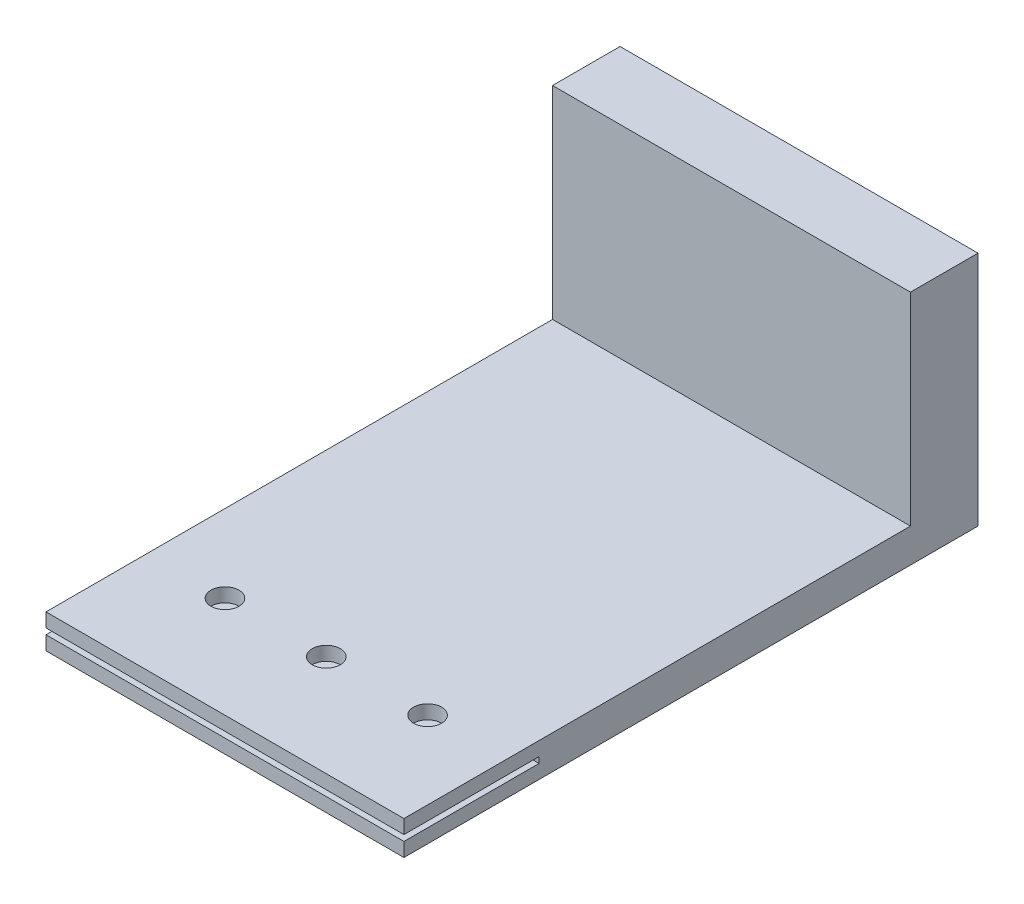
ISO-10303-21;
HEADER;
FILE_DESCRIPTION(('STEP AP214'),'2;1');
FILE_NAME('part.step','',(''),(''),'','','');
FILE_SCHEMA(('AUTOMOTIVE_DESIGN { 1 0 10303 214 1 1 1 1 }'));
ENDSEC;
DATA;
#1=APPLICATION_CONTEXT('core data for automotive mechanical design processes');
#2=APPLICATION_PROTOCOL_DEFINITION('international standard','automotive_design',2000,#1);
#3=PRODUCT_CONTEXT('',#1,'mechanical');
#4=PRODUCT('Part','Part','',(#3));
#5=PRODUCT_RELATED_PRODUCT_CATEGORY('part','',(#4));
#6=PRODUCT_DEFINITION_FORMATION('','',#4);
#7=PRODUCT_DEFINITION_CONTEXT('part definition',#1,'design');
#8=PRODUCT_DEFINITION('design','',#6,#7);
#9=PRODUCT_DEFINITION_SHAPE('','',#8);
#10=(LENGTH_UNIT() NAMED_UNIT(*) SI_UNIT(.MILLI.,.METRE.));
#11=(NAMED_UNIT(*) PLANE_ANGLE_UNIT() SI_UNIT($,.RADIAN.));
#12=(NAMED_UNIT(*) SI_UNIT($,.STERADIAN.) SOLID_ANGLE_UNIT());
#13=UNCERTAINTY_MEASURE_WITH_UNIT(LENGTH_MEASURE(1.E-05),#10,'distance_accuracy_value','');
#14=(GEOMETRIC_REPRESENTATION_CONTEXT(3) GLOBAL_UNCERTAINTY_ASSIGNED_CONTEXT((#13)) GLOBAL_UNIT_ASSIGNED_CONTEXT((#10,
#11,#12)) REPRESENTATION_CONTEXT('',''));
#15=CARTESIAN_POINT('',(0.,0.,0.));
#16=DIRECTION('',(0.,0.,1.));
#17=DIRECTION('',(1.,0.,0.));
#18=AXIS2_PLACEMENT_3D('',#15,#16,#17);
#19=CARTESIAN_POINT('',(53.,10.,85.));
#20=DIRECTION('',(-1.,0.,0.));
#21=DIRECTION('',(0.,0.,1.));
#22=AXIS2_PLACEMENT_3D('',#19,#20,#21);
#23=PLANE('',#22);
#24=DIRECTION('',(0.,0.,-1.));
#25=VECTOR('',#24,1.);
#26=CARTESIAN_POINT('',(53.,10.,85.));
#27=LINE('',#26,#25);
#28=CARTESIAN_POINT('',(53.,10.,85.));
#29=VERTEX_POINT('',#28);
#30=CARTESIAN_POINT('',(53.,10.,-65.));
#31=VERTEX_POINT('',#30);
#32=EDGE_CURVE('E113',#29,#31,#27,.T.);
#33=ORIENTED_EDGE('',*,*,#32,.F.);
#34=DIRECTION('',(0.,-1.,0.));
#35=VECTOR('',#34,1.);
#36=CARTESIAN_POINT('',(53.,10.,85.));
#37=LINE('',#36,#35);
#38=CARTESIAN_POINT('',(53.,5.87500000000001,85.));
#39=VERTEX_POINT('',#38);
#40=EDGE_CURVE('E117',#29,#39,#37,.T.);
#41=ORIENTED_EDGE('',*,*,#40,.T.);
#42=DIRECTION('',(0.,0.,1.));
#43=VECTOR('',#42,1.);
#44=CARTESIAN_POINT('',(53.,5.87500000000001,45.));
#45=LINE('',#44,#43);
#46=CARTESIAN_POINT('',(53.,5.87500000000001,45.));
#47=VERTEX_POINT('',#46);
#48=EDGE_CURVE('E186',#47,#39,#45,.T.);
#49=ORIENTED_EDGE('',*,*,#48,.F.);
#50=DIRECTION('',(0.,1.,0.));
#51=VECTOR('',#50,1.);
#52=CARTESIAN_POINT('',(53.,0.,45.));
#53=LINE('',#52,#51);
#54=CARTESIAN_POINT('',(53.,4.12500000000001,45.));
#55=VERTEX_POINT('',#54);
#56=EDGE_CURVE('E182',#55,#47,#53,.T.);
#57=ORIENTED_EDGE('',*,*,#56,.F.);
#58=DIRECTION('',(0.,0.,1.));
#59=VECTOR('',#58,1.);
#60=CARTESIAN_POINT('',(53.,4.12500000000001,45.));
#61=LINE('',#60,#59);
#62=CARTESIAN_POINT('',(53.,4.12500000000001,85.));
#63=VERTEX_POINT('',#62);
#64=EDGE_CURVE('E188',#55,#63,#61,.T.);
#65=ORIENTED_EDGE('',*,*,#64,.T.);
#66=CARTESIAN_POINT('',(53.,0.,85.));
#67=VERTEX_POINT('',#66);
#68=EDGE_CURVE('E133',#63,#67,#37,.T.);
#69=ORIENTED_EDGE('',*,*,#68,.T.);
#70=DIRECTION('',(0.,0.,-1.));
#71=VECTOR('',#70,1.);
#72=CARTESIAN_POINT('',(53.,0.,85.));
#73=LINE('',#72,#71);
#74=CARTESIAN_POINT('',(53.,0.,-85.));
#75=VERTEX_POINT('',#74);
#76=EDGE_CURVE('E211',#67,#75,#73,.T.);
#77=ORIENTED_EDGE('',*,*,#76,.T.);
#78=DIRECTION('',(0.,-1.,0.));
#79=VECTOR('',#78,1.);
#80=CARTESIAN_POINT('',(53.,10.,-85.));
#81=LINE('',#80,#79);
#82=CARTESIAN_POINT('',(53.,70.,-85.));
#83=VERTEX_POINT('',#82);
#84=EDGE_CURVE('E46',#83,#75,#81,.T.);
#85=ORIENTED_EDGE('',*,*,#84,.F.);
#86=DIRECTION('',(0.,0.,-1.));
#87=VECTOR('',#86,1.);
#88=CARTESIAN_POINT('',(53.,70.,-85.));
#89=LINE('',#88,#87);
#90=CARTESIAN_POINT('',(53.,70.,-65.));
#91=VERTEX_POINT('',#90);
#92=EDGE_CURVE('E203',#91,#83,#89,.T.);
#93=ORIENTED_EDGE('',*,*,#92,.F.);
#94=DIRECTION('',(0.,-1.,0.));
#95=VECTOR('',#94,1.);
#96=CARTESIAN_POINT('',(53.,70.,-65.));
#97=LINE('',#96,#95);
#98=EDGE_CURVE('E125',#91,#31,#97,.T.);
#99=ORIENTED_EDGE('',*,*,#98,.T.);
#100=EDGE_LOOP('',(#33,#41,#49,#57,#65,#69,#77,#85,#93,#99));
#101=FACE_BOUND('',#100,.T.);
#102=ADVANCED_FACE('F39',(#101),#23,.F.);
#103=CARTESIAN_POINT('',(-53.,10.,85.));
#104=DIRECTION('',(0.,0.,-1.));
#105=DIRECTION('',(-1.,0.,0.));
#106=AXIS2_PLACEMENT_3D('',#103,#104,#105);
#107=PLANE('',#106);
#108=DIRECTION('',(1.,0.,0.));
#109=VECTOR('',#108,1.);
#110=CARTESIAN_POINT('',(0.,4.12500000000001,85.));
#111=LINE('',#110,#109);
#112=CARTESIAN_POINT('',(-53.,4.12500000000001,85.));
#113=VERTEX_POINT('',#112);
#114=EDGE_CURVE('E177',#113,#63,#111,.T.);
#115=ORIENTED_EDGE('',*,*,#114,.F.);
#116=DIRECTION('',(0.,-1.,0.));
#117=VECTOR('',#116,1.);
#118=CARTESIAN_POINT('',(-53.,10.,85.));
#119=LINE('',#118,#117);
#120=CARTESIAN_POINT('',(-53.,0.,85.));
#121=VERTEX_POINT('',#120);
#122=EDGE_CURVE('E132',#113,#121,#119,.T.);
#123=ORIENTED_EDGE('',*,*,#122,.T.);
#124=DIRECTION('',(1.,0.,0.));
#125=VECTOR('',#124,1.);
#126=CARTESIAN_POINT('',(-53.,0.,85.));
#127=LINE('',#126,#125);
#128=EDGE_CURVE('E124',#121,#67,#127,.T.);
#129=ORIENTED_EDGE('',*,*,#128,.T.);
#130=ORIENTED_EDGE('',*,*,#68,.F.);
#131=EDGE_LOOP('',(#115,#123,#129,#130));
#132=FACE_BOUND('',#131,.T.);
#133=ADVANCED_FACE('F227',(#132),#107,.F.);
#134=CARTESIAN_POINT('',(0.,10.,0.));
#135=DIRECTION('',(0.,-1.,0.));
#136=DIRECTION('',(0.,0.,-1.));
#137=AXIS2_PLACEMENT_3D('',#134,#135,#136);
#138=PLANE('',#137);
#139=CARTESIAN_POINT('',(-30.,10.,55.));
#140=DIRECTION('',(0.,1.,0.));
#141=DIRECTION('',(0.,0.,1.));
#142=AXIS2_PLACEMENT_3D('',#139,#140,#141);
#143=CIRCLE('',#142,4.15);
#144=CARTESIAN_POINT('',(-30.,10.,59.15));
#145=VERTEX_POINT('',#144);
#146=EDGE_CURVE('E147',#145,#145,#143,.T.);
#147=ORIENTED_EDGE('',*,*,#146,.F.);
#148=EDGE_LOOP('',(#147));
#149=FACE_BOUND('',#148,.T.);
#150=CARTESIAN_POINT('',(0.,10.,55.));
#151=DIRECTION('',(0.,1.,0.));
#152=DIRECTION('',(0.,0.,1.));
#153=AXIS2_PLACEMENT_3D('',#150,#151,#152);
#154=CIRCLE('',#153,4.15);
#155=CARTESIAN_POINT('',(0.,10.,59.15));
#156=VERTEX_POINT('',#155);
#157=EDGE_CURVE('E313',#156,#156,#154,.T.);
#158=ORIENTED_EDGE('',*,*,#157,.F.);
#159=EDGE_LOOP('',(#158));
#160=FACE_BOUND('',#159,.T.);
#161=CARTESIAN_POINT('',(30.,10.,55.));
#162=DIRECTION('',(0.,1.,0.));
#163=DIRECTION('',(0.,0.,1.));
#164=AXIS2_PLACEMENT_3D('',#161,#162,#163);
#165=CIRCLE('',#164,4.15);
#166=CARTESIAN_POINT('',(30.,10.,59.15));
#167=VERTEX_POINT('',#166);
#168=EDGE_CURVE('E306',#167,#167,#165,.T.);
#169=ORIENTED_EDGE('',*,*,#168,.F.);
#170=EDGE_LOOP('',(#169));
#171=FACE_BOUND('',#170,.T.);
#172=DIRECTION('',(1.,0.,0.));
#173=VECTOR('',#172,1.);
#174=CARTESIAN_POINT('',(-53.,10.,-65.));
#175=LINE('',#174,#173);
#176=CARTESIAN_POINT('',(-53.,10.,-65.));
#177=VERTEX_POINT('',#176);
#178=EDGE_CURVE('E187',#177,#31,#175,.T.);
#179=ORIENTED_EDGE('',*,*,#178,.F.);
#180=DIRECTION('',(0.,0.,1.));
#181=VECTOR('',#180,1.);
#182=CARTESIAN_POINT('',(-53.,10.,85.));
#183=LINE('',#182,#181);
#184=CARTESIAN_POINT('',(-53.,10.,85.));
#185=VERTEX_POINT('',#184);
#186=EDGE_CURVE('E52',#177,#185,#183,.T.);
#187=ORIENTED_EDGE('',*,*,#186,.T.);
#188=DIRECTION('',(-1.,0.,0.));
#189=VECTOR('',#188,1.);
#190=CARTESIAN_POINT('',(-53.,10.,85.));
#191=LINE('',#190,#189);
#192=EDGE_CURVE('E11',#29,#185,#191,.T.);
#193=ORIENTED_EDGE('',*,*,#192,.F.);
#194=ORIENTED_EDGE('',*,*,#32,.T.);
#195=EDGE_LOOP('',(#179,#187,#193,#194));
#196=FACE_BOUND('',#195,.T.);
#197=ADVANCED_FACE('F127',(#149,#160,#171,#196),#138,.F.);
#198=CARTESIAN_POINT('',(-53.,10.,-85.));
#199=DIRECTION('',(0.,0.,1.));
#200=DIRECTION('',(1.,0.,0.));
#201=AXIS2_PLACEMENT_3D('',#198,#199,#200);
#202=PLANE('',#201);
#203=DIRECTION('',(-1.,0.,0.));
#204=VECTOR('',#203,1.);
#205=CARTESIAN_POINT('',(-53.,0.,-85.));
#206=LINE('',#205,#204);
#207=CARTESIAN_POINT('',(-53.,0.,-85.));
#208=VERTEX_POINT('',#207);
#209=EDGE_CURVE('E216',#75,#208,#206,.T.);
#210=ORIENTED_EDGE('',*,*,#209,.T.);
#211=DIRECTION('',(0.,-1.,0.));
#212=VECTOR('',#211,1.);
#213=CARTESIAN_POINT('',(-53.,10.,-85.));
#214=LINE('',#213,#212);
#215=CARTESIAN_POINT('',(-53.,70.,-85.));
#216=VERTEX_POINT('',#215);
#217=EDGE_CURVE('E143',#216,#208,#214,.T.);
#218=ORIENTED_EDGE('',*,*,#217,.F.);
#219=DIRECTION('',(-1.,0.,0.));
#220=VECTOR('',#219,1.);
#221=CARTESIAN_POINT('',(-53.,70.,-85.));
#222=LINE('',#221,#220);
#223=EDGE_CURVE('E204',#83,#216,#222,.T.);
#224=ORIENTED_EDGE('',*,*,#223,.F.);
#225=ORIENTED_EDGE('',*,*,#84,.T.);
#226=EDGE_LOOP('',(#210,#218,#224,#225));
#227=FACE_BOUND('',#226,.T.);
#228=ADVANCED_FACE('F239',(#227),#202,.F.);
#229=CARTESIAN_POINT('',(-53.,10.,85.));
#230=DIRECTION('',(1.,0.,0.));
#231=DIRECTION('',(0.,0.,-1.));
#232=AXIS2_PLACEMENT_3D('',#229,#230,#231);
#233=PLANE('',#232);
#234=CARTESIAN_POINT('',(-53.,5.87500000000001,85.));
#235=VERTEX_POINT('',#234);
#236=EDGE_CURVE('E137',#185,#235,#119,.T.);
#237=ORIENTED_EDGE('',*,*,#236,.F.);
#238=ORIENTED_EDGE('',*,*,#186,.F.);
#239=DIRECTION('',(0.,-1.,0.));
#240=VECTOR('',#239,1.);
#241=CARTESIAN_POINT('',(-53.,70.,-65.));
#242=LINE('',#241,#240);
#243=CARTESIAN_POINT('',(-53.,70.,-65.));
#244=VERTEX_POINT('',#243);
#245=EDGE_CURVE('E207',#244,#177,#242,.T.);
#246=ORIENTED_EDGE('',*,*,#245,.F.);
#247=DIRECTION('',(0.,0.,1.));
#248=VECTOR('',#247,1.);
#249=CARTESIAN_POINT('',(-53.,70.,-85.));
#250=LINE('',#249,#248);
#251=EDGE_CURVE('E198',#216,#244,#250,.T.);
#252=ORIENTED_EDGE('',*,*,#251,.F.);
#253=ORIENTED_EDGE('',*,*,#217,.T.);
#254=DIRECTION('',(0.,0.,1.));
#255=VECTOR('',#254,1.);
#256=CARTESIAN_POINT('',(-53.,0.,85.));
#257=LINE('',#256,#255);
#258=EDGE_CURVE('E220',#208,#121,#257,.T.);
#259=ORIENTED_EDGE('',*,*,#258,.T.);
#260=ORIENTED_EDGE('',*,*,#122,.F.);
#261=DIRECTION('',(0.,0.,1.));
#262=VECTOR('',#261,1.);
#263=CARTESIAN_POINT('',(-53.,4.12500000000001,45.));
#264=LINE('',#263,#262);
#265=CARTESIAN_POINT('',(-53.,4.12500000000001,45.));
#266=VERTEX_POINT('',#265);
#267=EDGE_CURVE('E195',#266,#113,#264,.T.);
#268=ORIENTED_EDGE('',*,*,#267,.F.);
#269=DIRECTION('',(0.,-1.,0.));
#270=VECTOR('',#269,1.);
#271=CARTESIAN_POINT('',(-53.,0.,45.));
#272=LINE('',#271,#270);
#273=CARTESIAN_POINT('',(-53.,5.87500000000001,45.));
#274=VERTEX_POINT('',#273);
#275=EDGE_CURVE('E174',#274,#266,#272,.T.);
#276=ORIENTED_EDGE('',*,*,#275,.F.);
#277=DIRECTION('',(0.,0.,1.));
#278=VECTOR('',#277,1.);
#279=CARTESIAN_POINT('',(-53.,5.87500000000001,45.));
#280=LINE('',#279,#278);
#281=EDGE_CURVE('E181',#274,#235,#280,.T.);
#282=ORIENTED_EDGE('',*,*,#281,.T.);
#283=EDGE_LOOP('',(#237,#238,#246,#252,#253,#259,#260,#268,#276,#282));
#284=FACE_BOUND('',#283,.T.);
#285=ADVANCED_FACE('F240',(#284),#233,.F.);
#286=ORIENTED_EDGE('',*,*,#40,.F.);
#287=ORIENTED_EDGE('',*,*,#192,.T.);
#288=ORIENTED_EDGE('',*,*,#236,.T.);
#289=DIRECTION('',(1.,0.,0.));
#290=VECTOR('',#289,1.);
#291=CARTESIAN_POINT('',(0.,5.87500000000001,85.));
#292=LINE('',#291,#290);
#293=EDGE_CURVE('E135',#235,#39,#292,.T.);
#294=ORIENTED_EDGE('',*,*,#293,.T.);
#295=EDGE_LOOP('',(#286,#287,#288,#294));
#296=FACE_BOUND('',#295,.T.);
#297=ADVANCED_FACE('F128',(#296),#107,.F.);
#298=CARTESIAN_POINT('',(0.,0.,0.));
#299=DIRECTION('',(0.,-1.,0.));
#300=DIRECTION('',(0.,0.,-1.));
#301=AXIS2_PLACEMENT_3D('',#298,#299,#300);
#302=PLANE('',#301);
#303=CARTESIAN_POINT('',(-30.,0.,55.));
#304=DIRECTION('',(0.,-1.,0.));
#305=DIRECTION('',(0.,0.,-1.));
#306=AXIS2_PLACEMENT_3D('',#303,#304,#305);
#307=CIRCLE('',#306,4.15);
#308=CARTESIAN_POINT('',(-30.,0.,50.85));
#309=VERTEX_POINT('',#308);
#310=EDGE_CURVE('E165',#309,#309,#307,.T.);
#311=ORIENTED_EDGE('',*,*,#310,.F.);
#312=EDGE_LOOP('',(#311));
#313=FACE_BOUND('',#312,.T.);
#314=CARTESIAN_POINT('',(0.,0.,55.));
#315=DIRECTION('',(0.,-1.,0.));
#316=DIRECTION('',(0.,0.,-1.));
#317=AXIS2_PLACEMENT_3D('',#314,#315,#316);
#318=CIRCLE('',#317,4.15);
#319=CARTESIAN_POINT('',(0.,0.,50.85));
#320=VERTEX_POINT('',#319);
#321=EDGE_CURVE('E158',#320,#320,#318,.T.);
#322=ORIENTED_EDGE('',*,*,#321,.F.);
#323=EDGE_LOOP('',(#322));
#324=FACE_BOUND('',#323,.T.);
#325=CARTESIAN_POINT('',(30.,0.,55.));
#326=DIRECTION('',(0.,-1.,0.));
#327=DIRECTION('',(0.,0.,-1.));
#328=AXIS2_PLACEMENT_3D('',#325,#326,#327);
#329=CIRCLE('',#328,4.15);
#330=CARTESIAN_POINT('',(30.,0.,50.85));
#331=VERTEX_POINT('',#330);
#332=EDGE_CURVE('E152',#331,#331,#329,.T.);
#333=ORIENTED_EDGE('',*,*,#332,.F.);
#334=EDGE_LOOP('',(#333));
#335=FACE_BOUND('',#334,.T.);
#336=ORIENTED_EDGE('',*,*,#76,.F.);
#337=ORIENTED_EDGE('',*,*,#128,.F.);
#338=ORIENTED_EDGE('',*,*,#258,.F.);
#339=ORIENTED_EDGE('',*,*,#209,.F.);
#340=EDGE_LOOP('',(#336,#337,#338,#339));
#341=FACE_BOUND('',#340,.T.);
#342=ADVANCED_FACE('F229',(#313,#324,#335,#341),#302,.T.);
#343=CARTESIAN_POINT('',(-53.,70.,-65.));
#344=DIRECTION('',(0.,0.,-1.));
#345=DIRECTION('',(-1.,0.,0.));
#346=AXIS2_PLACEMENT_3D('',#343,#344,#345);
#347=PLANE('',#346);
#348=ORIENTED_EDGE('',*,*,#178,.T.);
#349=ORIENTED_EDGE('',*,*,#98,.F.);
#350=DIRECTION('',(1.,0.,0.));
#351=VECTOR('',#350,1.);
#352=CARTESIAN_POINT('',(-53.,70.,-65.));
#353=LINE('',#352,#351);
#354=EDGE_CURVE('E200',#244,#91,#353,.T.);
#355=ORIENTED_EDGE('',*,*,#354,.F.);
#356=ORIENTED_EDGE('',*,*,#245,.T.);
#357=EDGE_LOOP('',(#348,#349,#355,#356));
#358=FACE_BOUND('',#357,.T.);
#359=ADVANCED_FACE('F261',(#358),#347,.F.);
#360=CARTESIAN_POINT('',(0.,70.,0.));
#361=DIRECTION('',(0.,1.,0.));
#362=DIRECTION('',(0.,0.,1.));
#363=AXIS2_PLACEMENT_3D('',#360,#361,#362);
#364=PLANE('',#363);
#365=ORIENTED_EDGE('',*,*,#251,.T.);
#366=ORIENTED_EDGE('',*,*,#354,.T.);
#367=ORIENTED_EDGE('',*,*,#92,.T.);
#368=ORIENTED_EDGE('',*,*,#223,.T.);
#369=EDGE_LOOP('',(#365,#366,#367,#368));
#370=FACE_BOUND('',#369,.T.);
#371=ADVANCED_FACE('F266',(#370),#364,.T.);
#372=CARTESIAN_POINT('',(0.,5.87500000000001,45.));
#373=DIRECTION('',(0.,-1.,0.));
#374=DIRECTION('',(0.,0.,-1.));
#375=AXIS2_PLACEMENT_3D('',#372,#373,#374);
#376=PLANE('',#375);
#377=CARTESIAN_POINT('',(-30.,5.87500000000001,55.));
#378=DIRECTION('',(0.,-1.,0.));
#379=DIRECTION('',(0.,0.,-1.));
#380=AXIS2_PLACEMENT_3D('',#377,#378,#379);
#381=CIRCLE('',#380,4.15);
#382=CARTESIAN_POINT('',(-30.,5.87500000000001,50.85));
#383=VERTEX_POINT('',#382);
#384=EDGE_CURVE('E160',#383,#383,#381,.T.);
#385=ORIENTED_EDGE('',*,*,#384,.F.);
#386=EDGE_LOOP('',(#385));
#387=FACE_BOUND('',#386,.T.);
#388=CARTESIAN_POINT('',(0.,5.87500000000001,55.));
#389=DIRECTION('',(0.,-1.,0.));
#390=DIRECTION('',(0.,0.,-1.));
#391=AXIS2_PLACEMENT_3D('',#388,#389,#390);
#392=CIRCLE('',#391,4.15);
#393=CARTESIAN_POINT('',(0.,5.87500000000001,50.85));
#394=VERTEX_POINT('',#393);
#395=EDGE_CURVE('E153',#394,#394,#392,.T.);
#396=ORIENTED_EDGE('',*,*,#395,.F.);
#397=EDGE_LOOP('',(#396));
#398=FACE_BOUND('',#397,.T.);
#399=CARTESIAN_POINT('',(30.,5.87500000000001,55.));
#400=DIRECTION('',(0.,-1.,0.));
#401=DIRECTION('',(0.,0.,-1.));
#402=AXIS2_PLACEMENT_3D('',#399,#400,#401);
#403=CIRCLE('',#402,4.15);
#404=CARTESIAN_POINT('',(30.,5.87500000000001,50.85));
#405=VERTEX_POINT('',#404);
#406=EDGE_CURVE('E149',#405,#405,#403,.T.);
#407=ORIENTED_EDGE('',*,*,#406,.F.);
#408=EDGE_LOOP('',(#407));
#409=FACE_BOUND('',#408,.T.);
#410=ORIENTED_EDGE('',*,*,#293,.F.);
#411=ORIENTED_EDGE('',*,*,#281,.F.);
#412=DIRECTION('',(1.,0.,0.));
#413=VECTOR('',#412,1.);
#414=CARTESIAN_POINT('',(0.,5.87500000000001,45.));
#415=LINE('',#414,#413);
#416=EDGE_CURVE('E58',#274,#47,#415,.T.);
#417=ORIENTED_EDGE('',*,*,#416,.T.);
#418=ORIENTED_EDGE('',*,*,#48,.T.);
#419=EDGE_LOOP('',(#410,#411,#417,#418));
#420=FACE_BOUND('',#419,.T.);
#421=ADVANCED_FACE('F267',(#387,#398,#409,#420),#376,.T.);
#422=CARTESIAN_POINT('',(0.,4.12500000000001,45.));
#423=DIRECTION('',(0.,-1.,0.));
#424=DIRECTION('',(0.,0.,-1.));
#425=AXIS2_PLACEMENT_3D('',#422,#423,#424);
#426=PLANE('',#425);
#427=CARTESIAN_POINT('',(-30.,4.12500000000001,55.));
#428=DIRECTION('',(0.,-1.,0.));
#429=DIRECTION('',(0.,0.,-1.));
#430=AXIS2_PLACEMENT_3D('',#427,#428,#429);
#431=CIRCLE('',#430,4.15);
#432=CARTESIAN_POINT('',(-30.,4.12500000000001,50.85));
#433=VERTEX_POINT('',#432);
#434=EDGE_CURVE('E154',#433,#433,#431,.T.);
#435=ORIENTED_EDGE('',*,*,#434,.T.);
#436=EDGE_LOOP('',(#435));
#437=FACE_BOUND('',#436,.T.);
#438=CARTESIAN_POINT('',(0.,4.12500000000001,55.));
#439=DIRECTION('',(0.,-1.,0.));
#440=DIRECTION('',(0.,0.,-1.));
#441=AXIS2_PLACEMENT_3D('',#438,#439,#440);
#442=CIRCLE('',#441,4.15);
#443=CARTESIAN_POINT('',(0.,4.12500000000001,50.85));
#444=VERTEX_POINT('',#443);
#445=EDGE_CURVE('E151',#444,#444,#442,.T.);
#446=ORIENTED_EDGE('',*,*,#445,.T.);
#447=EDGE_LOOP('',(#446));
#448=FACE_BOUND('',#447,.T.);
#449=CARTESIAN_POINT('',(30.,4.12500000000001,55.));
#450=DIRECTION('',(0.,-1.,0.));
#451=DIRECTION('',(0.,0.,-1.));
#452=AXIS2_PLACEMENT_3D('',#449,#450,#451);
#453=CIRCLE('',#452,4.15);
#454=CARTESIAN_POINT('',(30.,4.12500000000001,50.85));
#455=VERTEX_POINT('',#454);
#456=EDGE_CURVE('E148',#455,#455,#453,.T.);
#457=ORIENTED_EDGE('',*,*,#456,.T.);
#458=EDGE_LOOP('',(#457));
#459=FACE_BOUND('',#458,.T.);
#460=ORIENTED_EDGE('',*,*,#114,.T.);
#461=ORIENTED_EDGE('',*,*,#64,.F.);
#462=DIRECTION('',(1.,0.,0.));
#463=VECTOR('',#462,1.);
#464=CARTESIAN_POINT('',(0.,4.12500000000001,45.));
#465=LINE('',#464,#463);
#466=EDGE_CURVE('E178',#266,#55,#465,.T.);
#467=ORIENTED_EDGE('',*,*,#466,.F.);
#468=ORIENTED_EDGE('',*,*,#267,.T.);
#469=EDGE_LOOP('',(#460,#461,#467,#468));
#470=FACE_BOUND('',#469,.T.);
#471=ADVANCED_FACE('F233',(#437,#448,#459,#470),#426,.F.);
#472=CARTESIAN_POINT('',(0.,0.,45.));
#473=DIRECTION('',(0.,0.,1.));
#474=DIRECTION('',(1.,0.,0.));
#475=AXIS2_PLACEMENT_3D('',#472,#473,#474);
#476=PLANE('',#475);
#477=ORIENTED_EDGE('',*,*,#416,.F.);
#478=ORIENTED_EDGE('',*,*,#275,.T.);
#479=ORIENTED_EDGE('',*,*,#466,.T.);
#480=ORIENTED_EDGE('',*,*,#56,.T.);
#481=EDGE_LOOP('',(#477,#478,#479,#480));
#482=FACE_BOUND('',#481,.T.);
#483=ADVANCED_FACE('F234',(#482),#476,.T.);
#484=CARTESIAN_POINT('',(30.,-30.,55.));
#485=DIRECTION('',(0.,1.,0.));
#486=DIRECTION('',(0.,0.,1.));
#487=AXIS2_PLACEMENT_3D('',#484,#485,#486);
#488=CYLINDRICAL_SURFACE('',#487,4.15);
#489=ORIENTED_EDGE('',*,*,#332,.T.);
#490=EDGE_LOOP('',(#489));
#491=FACE_BOUND('',#490,.T.);
#492=ORIENTED_EDGE('',*,*,#456,.F.);
#493=EDGE_LOOP('',(#492));
#494=FACE_BOUND('',#493,.T.);
#495=ADVANCED_FACE('F280',(#491,#494),#488,.F.);
#496=CARTESIAN_POINT('',(0.,-30.,55.));
#497=DIRECTION('',(0.,1.,0.));
#498=DIRECTION('',(0.,0.,1.));
#499=AXIS2_PLACEMENT_3D('',#496,#497,#498);
#500=CYLINDRICAL_SURFACE('',#499,4.15);
#501=ORIENTED_EDGE('',*,*,#321,.T.);
#502=EDGE_LOOP('',(#501));
#503=FACE_BOUND('',#502,.T.);
#504=ORIENTED_EDGE('',*,*,#445,.F.);
#505=EDGE_LOOP('',(#504));
#506=FACE_BOUND('',#505,.T.);
#507=ADVANCED_FACE('F288',(#503,#506),#500,.F.);
#508=CARTESIAN_POINT('',(-30.,-30.,55.));
#509=DIRECTION('',(0.,1.,0.));
#510=DIRECTION('',(0.,0.,1.));
#511=AXIS2_PLACEMENT_3D('',#508,#509,#510);
#512=CYLINDRICAL_SURFACE('',#511,4.15);
#513=ORIENTED_EDGE('',*,*,#310,.T.);
#514=EDGE_LOOP('',(#513));
#515=FACE_BOUND('',#514,.T.);
#516=ORIENTED_EDGE('',*,*,#434,.F.);
#517=EDGE_LOOP('',(#516));
#518=FACE_BOUND('',#517,.T.);
#519=ADVANCED_FACE('F285',(#515,#518),#512,.F.);
#520=ORIENTED_EDGE('',*,*,#406,.T.);
#521=EDGE_LOOP('',(#520));
#522=FACE_BOUND('',#521,.T.);
#523=ORIENTED_EDGE('',*,*,#168,.T.);
#524=EDGE_LOOP('',(#523));
#525=FACE_BOUND('',#524,.T.);
#526=ADVANCED_FACE('F279',(#522,#525),#488,.F.);
#527=ORIENTED_EDGE('',*,*,#395,.T.);
#528=EDGE_LOOP('',(#527));
#529=FACE_BOUND('',#528,.T.);
#530=ORIENTED_EDGE('',*,*,#157,.T.);
#531=EDGE_LOOP('',(#530));
#532=FACE_BOUND('',#531,.T.);
#533=ADVANCED_FACE('F281',(#529,#532),#500,.F.);
#534=ORIENTED_EDGE('',*,*,#384,.T.);
#535=EDGE_LOOP('',(#534));
#536=FACE_BOUND('',#535,.T.);
#537=ORIENTED_EDGE('',*,*,#146,.T.);
#538=EDGE_LOOP('',(#537));
#539=FACE_BOUND('',#538,.T.);
#540=ADVANCED_FACE('F287',(#536,#539),#512,.F.);
#541=CLOSED_SHELL('',(#102,#133,#197,#228,#285,#297,#342,#359,#371,#421,#471,#483,#495,#507,
#519,#526,#533,#540));
#542=MANIFOLD_SOLID_BREP('B2',#541);
#543=ADVANCED_BREP_SHAPE_REPRESENTATION('',(#18,#542),#14);
#544=SHAPE_DEFINITION_REPRESENTATION(#9,#543);
ENDSEC;
END-ISO-10303-21;
